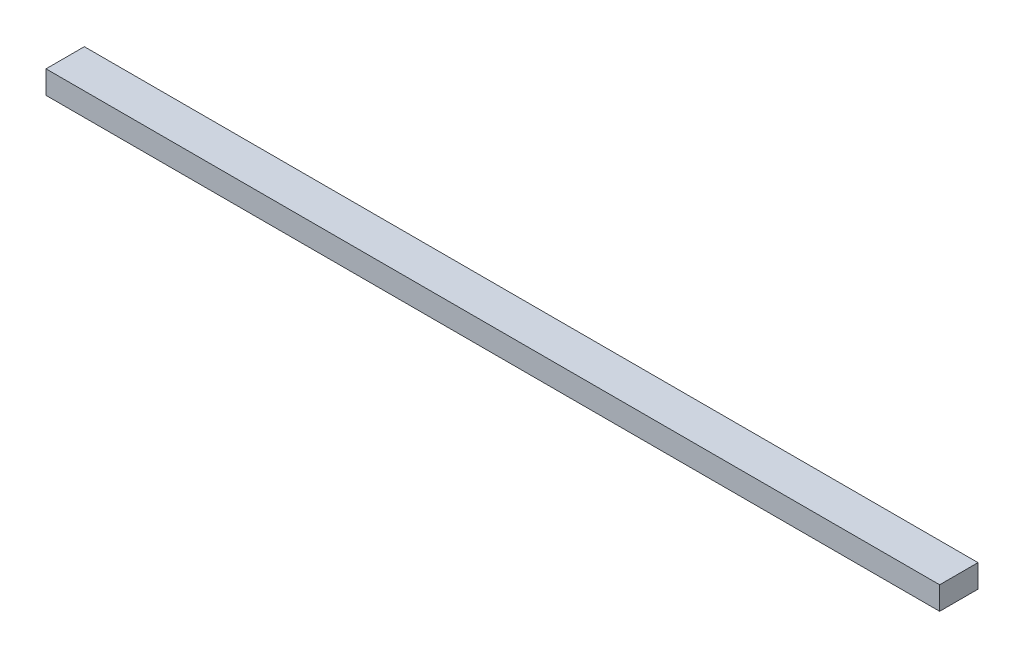
ISO-10303-21;
HEADER;
FILE_DESCRIPTION(('STEP AP214'),'2;1');
FILE_NAME('part.step','',(''),(''),'','','');
FILE_SCHEMA(('AUTOMOTIVE_DESIGN { 1 0 10303 214 1 1 1 1 }'));
ENDSEC;
DATA;
#1=APPLICATION_CONTEXT('core data for automotive mechanical design processes');
#2=APPLICATION_PROTOCOL_DEFINITION('international standard','automotive_design',2000,#1);
#3=PRODUCT_CONTEXT('',#1,'mechanical');
#4=PRODUCT('Part','Part','',(#3));
#5=PRODUCT_RELATED_PRODUCT_CATEGORY('part','',(#4));
#6=PRODUCT_DEFINITION_FORMATION('','',#4);
#7=PRODUCT_DEFINITION_CONTEXT('part definition',#1,'design');
#8=PRODUCT_DEFINITION('design','',#6,#7);
#9=PRODUCT_DEFINITION_SHAPE('','',#8);
#10=(LENGTH_UNIT() NAMED_UNIT(*) SI_UNIT(.MILLI.,.METRE.));
#11=(NAMED_UNIT(*) PLANE_ANGLE_UNIT() SI_UNIT($,.RADIAN.));
#12=(NAMED_UNIT(*) SI_UNIT($,.STERADIAN.) SOLID_ANGLE_UNIT());
#13=UNCERTAINTY_MEASURE_WITH_UNIT(LENGTH_MEASURE(1.E-05),#10,'distance_accuracy_value','');
#14=(GEOMETRIC_REPRESENTATION_CONTEXT(3) GLOBAL_UNCERTAINTY_ASSIGNED_CONTEXT((#13)) GLOBAL_UNIT_ASSIGNED_CONTEXT((#10,
#11,#12)) REPRESENTATION_CONTEXT('',''));
#15=CARTESIAN_POINT('',(0.,0.,0.));
#16=DIRECTION('',(0.,0.,1.));
#17=DIRECTION('',(1.,0.,0.));
#18=AXIS2_PLACEMENT_3D('',#15,#16,#17);
#19=CARTESIAN_POINT('',(0.,60.,0.));
#20=DIRECTION('',(1.,0.,0.));
#21=DIRECTION('',(0.,0.,-1.));
#22=AXIS2_PLACEMENT_3D('',#19,#20,#21);
#23=PLANE('',#22);
#24=DIRECTION('',(0.,0.,1.));
#25=VECTOR('',#24,1.);
#26=CARTESIAN_POINT('',(0.,0.,0.));
#27=LINE('',#26,#25);
#28=CARTESIAN_POINT('',(0.,0.,-100.));
#29=VERTEX_POINT('',#28);
#30=CARTESIAN_POINT('',(0.,0.,0.));
#31=VERTEX_POINT('',#30);
#32=EDGE_CURVE('E102',#29,#31,#27,.T.);
#33=ORIENTED_EDGE('',*,*,#32,.T.);
#34=DIRECTION('',(0.,-1.,0.));
#35=VECTOR('',#34,1.);
#36=CARTESIAN_POINT('',(0.,60.,0.));
#37=LINE('',#36,#35);
#38=CARTESIAN_POINT('',(0.,60.,0.));
#39=VERTEX_POINT('',#38);
#40=EDGE_CURVE('E11',#39,#31,#37,.T.);
#41=ORIENTED_EDGE('',*,*,#40,.F.);
#42=DIRECTION('',(0.,0.,1.));
#43=VECTOR('',#42,1.);
#44=CARTESIAN_POINT('',(0.,60.,0.));
#45=LINE('',#44,#43);
#46=CARTESIAN_POINT('',(0.,60.,-100.));
#47=VERTEX_POINT('',#46);
#48=EDGE_CURVE('E95',#47,#39,#45,.T.);
#49=ORIENTED_EDGE('',*,*,#48,.F.);
#50=DIRECTION('',(0.,-1.,0.));
#51=VECTOR('',#50,1.);
#52=CARTESIAN_POINT('',(0.,60.,-100.));
#53=LINE('',#52,#51);
#54=EDGE_CURVE('E99',#47,#29,#53,.T.);
#55=ORIENTED_EDGE('',*,*,#54,.T.);
#56=EDGE_LOOP('',(#33,#41,#49,#55));
#57=FACE_BOUND('',#56,.T.);
#58=ADVANCED_FACE('F41',(#57),#23,.F.);
#59=CARTESIAN_POINT('',(0.,60.,0.));
#60=DIRECTION('',(0.,0.,-1.));
#61=DIRECTION('',(-1.,0.,0.));
#62=AXIS2_PLACEMENT_3D('',#59,#60,#61);
#63=PLANE('',#62);
#64=DIRECTION('',(1.,0.,0.));
#65=VECTOR('',#64,1.);
#66=CARTESIAN_POINT('',(0.,0.,0.));
#67=LINE('',#66,#65);
#68=CARTESIAN_POINT('',(2330.,0.,0.));
#69=VERTEX_POINT('',#68);
#70=EDGE_CURVE('E96',#31,#69,#67,.T.);
#71=ORIENTED_EDGE('',*,*,#70,.T.);
#72=DIRECTION('',(0.,-1.,0.));
#73=VECTOR('',#72,1.);
#74=CARTESIAN_POINT('',(2330.,60.,0.));
#75=LINE('',#74,#73);
#76=CARTESIAN_POINT('',(2330.,60.,0.));
#77=VERTEX_POINT('',#76);
#78=EDGE_CURVE('E47',#77,#69,#75,.T.);
#79=ORIENTED_EDGE('',*,*,#78,.F.);
#80=DIRECTION('',(1.,0.,0.));
#81=VECTOR('',#80,1.);
#82=CARTESIAN_POINT('',(0.,60.,0.));
#83=LINE('',#82,#81);
#84=EDGE_CURVE('E87',#39,#77,#83,.T.);
#85=ORIENTED_EDGE('',*,*,#84,.F.);
#86=ORIENTED_EDGE('',*,*,#40,.T.);
#87=EDGE_LOOP('',(#71,#79,#85,#86));
#88=FACE_BOUND('',#87,.T.);
#89=ADVANCED_FACE('F92',(#88),#63,.F.);
#90=CARTESIAN_POINT('',(2330.,60.,0.));
#91=DIRECTION('',(-1.,0.,0.));
#92=DIRECTION('',(0.,0.,1.));
#93=AXIS2_PLACEMENT_3D('',#90,#91,#92);
#94=PLANE('',#93);
#95=DIRECTION('',(0.,0.,-1.));
#96=VECTOR('',#95,1.);
#97=CARTESIAN_POINT('',(2330.,0.,0.));
#98=LINE('',#97,#96);
#99=CARTESIAN_POINT('',(2330.,0.,-100.));
#100=VERTEX_POINT('',#99);
#101=EDGE_CURVE('E74',#69,#100,#98,.T.);
#102=ORIENTED_EDGE('',*,*,#101,.T.);
#103=DIRECTION('',(0.,-1.,0.));
#104=VECTOR('',#103,1.);
#105=CARTESIAN_POINT('',(2330.,60.,-100.));
#106=LINE('',#105,#104);
#107=CARTESIAN_POINT('',(2330.,60.,-100.));
#108=VERTEX_POINT('',#107);
#109=EDGE_CURVE('E100',#108,#100,#106,.T.);
#110=ORIENTED_EDGE('',*,*,#109,.F.);
#111=DIRECTION('',(0.,0.,-1.));
#112=VECTOR('',#111,1.);
#113=CARTESIAN_POINT('',(2330.,60.,0.));
#114=LINE('',#113,#112);
#115=EDGE_CURVE('E89',#77,#108,#114,.T.);
#116=ORIENTED_EDGE('',*,*,#115,.F.);
#117=ORIENTED_EDGE('',*,*,#78,.T.);
#118=EDGE_LOOP('',(#102,#110,#116,#117));
#119=FACE_BOUND('',#118,.T.);
#120=ADVANCED_FACE('F98',(#119),#94,.F.);
#121=CARTESIAN_POINT('',(0.,60.,-100.));
#122=DIRECTION('',(0.,0.,1.));
#123=DIRECTION('',(1.,0.,0.));
#124=AXIS2_PLACEMENT_3D('',#121,#122,#123);
#125=PLANE('',#124);
#126=DIRECTION('',(-1.,0.,0.));
#127=VECTOR('',#126,1.);
#128=CARTESIAN_POINT('',(0.,0.,-100.));
#129=LINE('',#128,#127);
#130=EDGE_CURVE('E78',#100,#29,#129,.T.);
#131=ORIENTED_EDGE('',*,*,#130,.T.);
#132=ORIENTED_EDGE('',*,*,#54,.F.);
#133=DIRECTION('',(-1.,0.,0.));
#134=VECTOR('',#133,1.);
#135=CARTESIAN_POINT('',(0.,60.,-100.));
#136=LINE('',#135,#134);
#137=EDGE_CURVE('E60',#108,#47,#136,.T.);
#138=ORIENTED_EDGE('',*,*,#137,.F.);
#139=ORIENTED_EDGE('',*,*,#109,.T.);
#140=EDGE_LOOP('',(#131,#132,#138,#139));
#141=FACE_BOUND('',#140,.T.);
#142=ADVANCED_FACE('F112',(#141),#125,.F.);
#143=CARTESIAN_POINT('',(0.,60.,0.));
#144=DIRECTION('',(0.,-1.,0.));
#145=DIRECTION('',(0.,0.,-1.));
#146=AXIS2_PLACEMENT_3D('',#143,#144,#145);
#147=PLANE('',#146);
#148=ORIENTED_EDGE('',*,*,#48,.T.);
#149=ORIENTED_EDGE('',*,*,#84,.T.);
#150=ORIENTED_EDGE('',*,*,#115,.T.);
#151=ORIENTED_EDGE('',*,*,#137,.T.);
#152=EDGE_LOOP('',(#148,#149,#150,#151));
#153=FACE_BOUND('',#152,.T.);
#154=ADVANCED_FACE('F86',(#153),#147,.F.);
#155=CARTESIAN_POINT('',(0.,0.,0.));
#156=DIRECTION('',(0.,-1.,0.));
#157=DIRECTION('',(0.,0.,-1.));
#158=AXIS2_PLACEMENT_3D('',#155,#156,#157);
#159=PLANE('',#158);
#160=ORIENTED_EDGE('',*,*,#32,.F.);
#161=ORIENTED_EDGE('',*,*,#130,.F.);
#162=ORIENTED_EDGE('',*,*,#101,.F.);
#163=ORIENTED_EDGE('',*,*,#70,.F.);
#164=EDGE_LOOP('',(#160,#161,#162,#163));
#165=FACE_BOUND('',#164,.T.);
#166=ADVANCED_FACE('F111',(#165),#159,.T.);
#167=CLOSED_SHELL('',(#58,#89,#120,#142,#154,#166));
#168=MANIFOLD_SOLID_BREP('B2',#167);
#169=ADVANCED_BREP_SHAPE_REPRESENTATION('',(#18,#168),#14);
#170=SHAPE_DEFINITION_REPRESENTATION(#9,#169);
ENDSEC;
END-ISO-10303-21;
